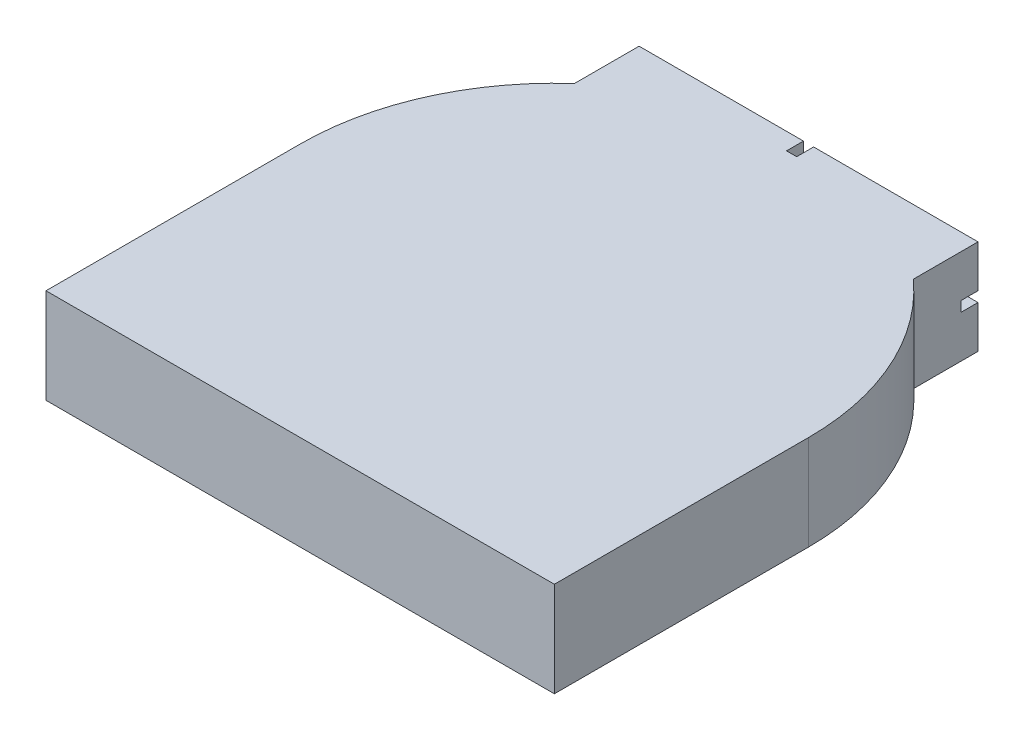
ISO-10303-21;
HEADER;
FILE_DESCRIPTION(('STEP AP214'),'2;1');
FILE_NAME('part.step','',(''),(''),'','','');
FILE_SCHEMA(('AUTOMOTIVE_DESIGN { 1 0 10303 214 1 1 1 1 }'));
ENDSEC;
DATA;
#1=APPLICATION_CONTEXT('core data for automotive mechanical design processes');
#2=APPLICATION_PROTOCOL_DEFINITION('international standard','automotive_design',2000,#1);
#3=PRODUCT_CONTEXT('',#1,'mechanical');
#4=PRODUCT('Part','Part','',(#3));
#5=PRODUCT_RELATED_PRODUCT_CATEGORY('part','',(#4));
#6=PRODUCT_DEFINITION_FORMATION('','',#4);
#7=PRODUCT_DEFINITION_CONTEXT('part definition',#1,'design');
#8=PRODUCT_DEFINITION('design','',#6,#7);
#9=PRODUCT_DEFINITION_SHAPE('','',#8);
#10=(LENGTH_UNIT() NAMED_UNIT(*) SI_UNIT(.MILLI.,.METRE.));
#11=(NAMED_UNIT(*) PLANE_ANGLE_UNIT() SI_UNIT($,.RADIAN.));
#12=(NAMED_UNIT(*) SI_UNIT($,.STERADIAN.) SOLID_ANGLE_UNIT());
#13=UNCERTAINTY_MEASURE_WITH_UNIT(LENGTH_MEASURE(1.E-05),#10,'distance_accuracy_value','');
#14=(GEOMETRIC_REPRESENTATION_CONTEXT(3) GLOBAL_UNCERTAINTY_ASSIGNED_CONTEXT((#13)) GLOBAL_UNIT_ASSIGNED_CONTEXT((#10,
#11,#12)) REPRESENTATION_CONTEXT('',''));
#15=CARTESIAN_POINT('',(0.,0.,0.));
#16=DIRECTION('',(0.,0.,1.));
#17=DIRECTION('',(1.,0.,0.));
#18=AXIS2_PLACEMENT_3D('',#15,#16,#17);
#19=CARTESIAN_POINT('',(3.,0.8,-7.5));
#20=DIRECTION('',(0.,0.,1.));
#21=DIRECTION('',(1.,0.,0.));
#22=AXIS2_PLACEMENT_3D('',#19,#20,#21);
#23=PLANE('',#22);
#24=DIRECTION('',(-1.,0.,0.));
#25=VECTOR('',#24,1.);
#26=CARTESIAN_POINT('',(-3.,0.8,-7.5));
#27=LINE('',#26,#25);
#28=CARTESIAN_POINT('',(3.,0.8,-7.5));
#29=VERTEX_POINT('',#28);
#30=CARTESIAN_POINT('',(0.15,0.8,-7.5));
#31=VERTEX_POINT('',#30);
#32=EDGE_CURVE('E360',#29,#31,#27,.T.);
#33=ORIENTED_EDGE('',*,*,#32,.T.);
#34=DIRECTION('',(0.,-1.,0.));
#35=VECTOR('',#34,1.);
#36=CARTESIAN_POINT('',(0.15,1.8,-7.5));
#37=LINE('',#36,#35);
#38=CARTESIAN_POINT('',(0.15,1.8,-7.5));
#39=VERTEX_POINT('',#38);
#40=EDGE_CURVE('E280',#39,#31,#37,.T.);
#41=ORIENTED_EDGE('',*,*,#40,.F.);
#42=DIRECTION('',(-1.,0.,0.));
#43=VECTOR('',#42,1.);
#44=CARTESIAN_POINT('',(5.,1.8,-7.5));
#45=LINE('',#44,#43);
#46=CARTESIAN_POINT('',(5.,1.8,-7.5));
#47=VERTEX_POINT('',#46);
#48=EDGE_CURVE('E364',#47,#39,#45,.T.);
#49=ORIENTED_EDGE('',*,*,#48,.F.);
#50=DIRECTION('',(0.,-1.,0.));
#51=VECTOR('',#50,1.);
#52=CARTESIAN_POINT('',(5.,0.8,-7.5));
#53=LINE('',#52,#51);
#54=CARTESIAN_POINT('',(5.,0.55,-7.5));
#55=VERTEX_POINT('',#54);
#56=EDGE_CURVE('E428',#47,#55,#53,.T.);
#57=ORIENTED_EDGE('',*,*,#56,.T.);
#58=DIRECTION('',(1.,0.,0.));
#59=VECTOR('',#58,1.);
#60=CARTESIAN_POINT('',(5.,0.55,-7.5));
#61=LINE('',#60,#59);
#62=CARTESIAN_POINT('',(3.,0.55,-7.5));
#63=VERTEX_POINT('',#62);
#64=EDGE_CURVE('E248',#63,#55,#61,.T.);
#65=ORIENTED_EDGE('',*,*,#64,.F.);
#66=DIRECTION('',(0.,-1.,0.));
#67=VECTOR('',#66,1.);
#68=CARTESIAN_POINT('',(3.,0.8,-7.5));
#69=LINE('',#68,#67);
#70=EDGE_CURVE('E424',#29,#63,#69,.T.);
#71=ORIENTED_EDGE('',*,*,#70,.F.);
#72=EDGE_LOOP('',(#33,#41,#49,#57,#65,#71));
#73=FACE_BOUND('',#72,.T.);
#74=ADVANCED_FACE('F36',(#73),#23,.F.);
#75=CARTESIAN_POINT('',(-0.15,1.8,-7.5));
#76=VERTEX_POINT('',#75);
#77=CARTESIAN_POINT('',(-5.,1.8,-7.5));
#78=VERTEX_POINT('',#77);
#79=EDGE_CURVE('E363',#76,#78,#45,.T.);
#80=ORIENTED_EDGE('',*,*,#79,.F.);
#81=DIRECTION('',(0.,1.,0.));
#82=VECTOR('',#81,1.);
#83=CARTESIAN_POINT('',(-0.15,1.8,-7.5));
#84=LINE('',#83,#82);
#85=CARTESIAN_POINT('',(-0.15,0.8,-7.5));
#86=VERTEX_POINT('',#85);
#87=EDGE_CURVE('E293',#86,#76,#84,.T.);
#88=ORIENTED_EDGE('',*,*,#87,.F.);
#89=CARTESIAN_POINT('',(-3.,0.8,-7.5));
#90=VERTEX_POINT('',#89);
#91=EDGE_CURVE('E352',#86,#90,#27,.T.);
#92=ORIENTED_EDGE('',*,*,#91,.T.);
#93=DIRECTION('',(0.,-1.,0.));
#94=VECTOR('',#93,1.);
#95=CARTESIAN_POINT('',(-3.,0.8,-7.5));
#96=LINE('',#95,#94);
#97=CARTESIAN_POINT('',(-3.,0.55,-7.5));
#98=VERTEX_POINT('',#97);
#99=EDGE_CURVE('E447',#90,#98,#96,.T.);
#100=ORIENTED_EDGE('',*,*,#99,.T.);
#101=DIRECTION('',(1.,0.,0.));
#102=VECTOR('',#101,1.);
#103=CARTESIAN_POINT('',(-0.15,0.55,-7.5));
#104=LINE('',#103,#102);
#105=CARTESIAN_POINT('',(-5.,0.55,-7.5));
#106=VERTEX_POINT('',#105);
#107=EDGE_CURVE('E291',#106,#98,#104,.T.);
#108=ORIENTED_EDGE('',*,*,#107,.F.);
#109=DIRECTION('',(0.,-1.,0.));
#110=VECTOR('',#109,1.);
#111=CARTESIAN_POINT('',(-5.,0.8,-7.5));
#112=LINE('',#111,#110);
#113=EDGE_CURVE('E443',#78,#106,#112,.T.);
#114=ORIENTED_EDGE('',*,*,#113,.F.);
#115=EDGE_LOOP('',(#80,#88,#92,#100,#108,#114));
#116=FACE_BOUND('',#115,.T.);
#117=ADVANCED_FACE('F522',(#116),#23,.F.);
#118=CARTESIAN_POINT('',(-5.,0.25,-7.5));
#119=VERTEX_POINT('',#118);
#120=CARTESIAN_POINT('',(-5.,-1.,-7.5));
#121=VERTEX_POINT('',#120);
#122=EDGE_CURVE('E442',#119,#121,#112,.T.);
#123=ORIENTED_EDGE('',*,*,#122,.F.);
#124=DIRECTION('',(-1.,0.,0.));
#125=VECTOR('',#124,1.);
#126=CARTESIAN_POINT('',(-0.15,0.25,-7.5));
#127=LINE('',#126,#125);
#128=CARTESIAN_POINT('',(-3.,0.25,-7.5));
#129=VERTEX_POINT('',#128);
#130=EDGE_CURVE('E289',#129,#119,#127,.T.);
#131=ORIENTED_EDGE('',*,*,#130,.F.);
#132=CARTESIAN_POINT('',(-3.,0.,-7.5));
#133=VERTEX_POINT('',#132);
#134=EDGE_CURVE('E446',#129,#133,#96,.T.);
#135=ORIENTED_EDGE('',*,*,#134,.T.);
#136=DIRECTION('',(1.,0.,0.));
#137=VECTOR('',#136,1.);
#138=CARTESIAN_POINT('',(-3.,0.,-7.5));
#139=LINE('',#138,#137);
#140=CARTESIAN_POINT('',(-0.15,0.,-7.5));
#141=VERTEX_POINT('',#140);
#142=EDGE_CURVE('E353',#133,#141,#139,.T.);
#143=ORIENTED_EDGE('',*,*,#142,.T.);
#144=DIRECTION('',(0.,1.,0.));
#145=VECTOR('',#144,1.);
#146=CARTESIAN_POINT('',(-0.15,0.25,-7.5));
#147=LINE('',#146,#145);
#148=CARTESIAN_POINT('',(-0.15,-1.,-7.5));
#149=VERTEX_POINT('',#148);
#150=EDGE_CURVE('E287',#149,#141,#147,.T.);
#151=ORIENTED_EDGE('',*,*,#150,.F.);
#152=DIRECTION('',(1.,0.,0.));
#153=VECTOR('',#152,1.);
#154=CARTESIAN_POINT('',(-3.,-1.,-7.5));
#155=LINE('',#154,#153);
#156=EDGE_CURVE('E327',#121,#149,#155,.T.);
#157=ORIENTED_EDGE('',*,*,#156,.F.);
#158=EDGE_LOOP('',(#123,#131,#135,#143,#151,#157));
#159=FACE_BOUND('',#158,.T.);
#160=ADVANCED_FACE('F567',(#159),#23,.F.);
#161=CARTESIAN_POINT('',(-4.,0.8,-5.1234753829798));
#162=DIRECTION('',(0.,-1.,0.));
#163=DIRECTION('',(0.,0.,-1.));
#164=AXIS2_PLACEMENT_3D('',#161,#162,#163);
#165=CYLINDRICAL_SURFACE('',#164,1.);
#166=CARTESIAN_POINT('',(-4.,0.,-5.1234753829798));
#167=DIRECTION('',(0.,1.,0.));
#168=DIRECTION('',(0.,0.,1.));
#169=AXIS2_PLACEMENT_3D('',#166,#167,#168);
#170=CIRCLE('',#169,1.);
#171=CARTESIAN_POINT('',(-3.38461538461538,0.,-4.33524840098291));
#172=VERTEX_POINT('',#171);
#173=CARTESIAN_POINT('',(-3.,0.,-5.1234753829798));
#174=VERTEX_POINT('',#173);
#175=EDGE_CURVE('E382',#172,#174,#170,.T.);
#176=ORIENTED_EDGE('',*,*,#175,.T.);
#177=DIRECTION('',(0.,-1.,0.));
#178=VECTOR('',#177,1.);
#179=CARTESIAN_POINT('',(-3.,0.8,-5.1234753829798));
#180=LINE('',#179,#178);
#181=CARTESIAN_POINT('',(-3.,0.8,-5.1234753829798));
#182=VERTEX_POINT('',#181);
#183=EDGE_CURVE('E450',#182,#174,#180,.T.);
#184=ORIENTED_EDGE('',*,*,#183,.F.);
#185=CARTESIAN_POINT('',(-4.,0.8,-5.1234753829798));
#186=DIRECTION('',(0.,1.,0.));
#187=DIRECTION('',(0.,0.,1.));
#188=AXIS2_PLACEMENT_3D('',#185,#186,#187);
#189=CIRCLE('',#188,1.);
#190=CARTESIAN_POINT('',(-3.38461538461538,0.8,-4.33524840098291));
#191=VERTEX_POINT('',#190);
#192=EDGE_CURVE('E385',#191,#182,#189,.T.);
#193=ORIENTED_EDGE('',*,*,#192,.F.);
#194=DIRECTION('',(0.,-1.,0.));
#195=VECTOR('',#194,1.);
#196=CARTESIAN_POINT('',(-3.38461538461538,0.8,-4.33524840098291));
#197=LINE('',#196,#195);
#198=EDGE_CURVE('E401',#191,#172,#197,.T.);
#199=ORIENTED_EDGE('',*,*,#198,.T.);
#200=EDGE_LOOP('',(#176,#184,#193,#199));
#201=FACE_BOUND('',#200,.T.);
#202=ADVANCED_FACE('F38',(#201),#165,.T.);
#203=CARTESIAN_POINT('',(-3.,0.8,-5.5));
#204=DIRECTION('',(-1.,0.,0.));
#205=DIRECTION('',(0.,0.,1.));
#206=AXIS2_PLACEMENT_3D('',#203,#204,#205);
#207=PLANE('',#206);
#208=DIRECTION('',(0.,-1.,0.));
#209=VECTOR('',#208,1.);
#210=CARTESIAN_POINT('',(-3.,0.8,-7.));
#211=LINE('',#210,#209);
#212=CARTESIAN_POINT('',(-3.,0.55,-7.));
#213=VERTEX_POINT('',#212);
#214=CARTESIAN_POINT('',(-3.,0.25,-7.));
#215=VERTEX_POINT('',#214);
#216=EDGE_CURVE('E314',#213,#215,#211,.T.);
#217=ORIENTED_EDGE('',*,*,#216,.F.);
#218=DIRECTION('',(0.,0.,-1.));
#219=VECTOR('',#218,1.);
#220=CARTESIAN_POINT('',(-3.,0.55,-5.5));
#221=LINE('',#220,#219);
#222=EDGE_CURVE('E323',#213,#98,#221,.T.);
#223=ORIENTED_EDGE('',*,*,#222,.T.);
#224=ORIENTED_EDGE('',*,*,#99,.F.);
#225=DIRECTION('',(0.,0.,-1.));
#226=VECTOR('',#225,1.);
#227=CARTESIAN_POINT('',(-3.,0.8,-5.5));
#228=LINE('',#227,#226);
#229=EDGE_CURVE('E388',#182,#90,#228,.T.);
#230=ORIENTED_EDGE('',*,*,#229,.F.);
#231=ORIENTED_EDGE('',*,*,#183,.T.);
#232=DIRECTION('',(0.,0.,-1.));
#233=VECTOR('',#232,1.);
#234=CARTESIAN_POINT('',(-3.,0.,-5.5));
#235=LINE('',#234,#233);
#236=EDGE_CURVE('E404',#174,#133,#235,.T.);
#237=ORIENTED_EDGE('',*,*,#236,.T.);
#238=ORIENTED_EDGE('',*,*,#134,.F.);
#239=DIRECTION('',(0.,0.,1.));
#240=VECTOR('',#239,1.);
#241=CARTESIAN_POINT('',(-3.,0.25,-5.5));
#242=LINE('',#241,#240);
#243=EDGE_CURVE('E51',#129,#215,#242,.T.);
#244=ORIENTED_EDGE('',*,*,#243,.T.);
#245=EDGE_LOOP('',(#217,#223,#224,#230,#231,#237,#238,#244));
#246=FACE_BOUND('',#245,.T.);
#247=ADVANCED_FACE('F526',(#246),#207,.F.);
#248=CARTESIAN_POINT('',(-5.,0.8,-7.5));
#249=DIRECTION('',(1.,0.,0.));
#250=DIRECTION('',(0.,0.,-1.));
#251=AXIS2_PLACEMENT_3D('',#248,#249,#250);
#252=PLANE('',#251);
#253=ORIENTED_EDGE('',*,*,#113,.T.);
#254=DIRECTION('',(0.,0.,-1.));
#255=VECTOR('',#254,1.);
#256=CARTESIAN_POINT('',(-5.,0.55,-7.));
#257=LINE('',#256,#255);
#258=CARTESIAN_POINT('',(-5.,0.55,-7.));
#259=VERTEX_POINT('',#258);
#260=EDGE_CURVE('E301',#259,#106,#257,.T.);
#261=ORIENTED_EDGE('',*,*,#260,.F.);
#262=DIRECTION('',(0.,1.,0.));
#263=VECTOR('',#262,1.);
#264=CARTESIAN_POINT('',(-5.,0.55,-7.));
#265=LINE('',#264,#263);
#266=CARTESIAN_POINT('',(-5.,0.25,-7.));
#267=VERTEX_POINT('',#266);
#268=EDGE_CURVE('E269',#267,#259,#265,.T.);
#269=ORIENTED_EDGE('',*,*,#268,.F.);
#270=DIRECTION('',(0.,0.,-1.));
#271=VECTOR('',#270,1.);
#272=CARTESIAN_POINT('',(-5.,0.25,-7.));
#273=LINE('',#272,#271);
#274=EDGE_CURVE('E303',#267,#119,#273,.T.);
#275=ORIENTED_EDGE('',*,*,#274,.T.);
#276=ORIENTED_EDGE('',*,*,#122,.T.);
#277=DIRECTION('',(0.,0.,-1.));
#278=VECTOR('',#277,1.);
#279=CARTESIAN_POINT('',(-5.,-1.,-7.5));
#280=LINE('',#279,#278);
#281=CARTESIAN_POINT('',(-5.,-1.,-5.59016994374947));
#282=VERTEX_POINT('',#281);
#283=EDGE_CURVE('E349',#282,#121,#280,.T.);
#284=ORIENTED_EDGE('',*,*,#283,.F.);
#285=DIRECTION('',(0.,-1.,0.));
#286=VECTOR('',#285,1.);
#287=CARTESIAN_POINT('',(-5.,0.8,-5.59016994374947));
#288=LINE('',#287,#286);
#289=CARTESIAN_POINT('',(-5.,1.8,-5.59016994374947));
#290=VERTEX_POINT('',#289);
#291=EDGE_CURVE('E440',#290,#282,#288,.T.);
#292=ORIENTED_EDGE('',*,*,#291,.F.);
#293=DIRECTION('',(0.,0.,1.));
#294=VECTOR('',#293,1.);
#295=CARTESIAN_POINT('',(-5.,1.8,-7.5));
#296=LINE('',#295,#294);
#297=EDGE_CURVE('E367',#78,#290,#296,.T.);
#298=ORIENTED_EDGE('',*,*,#297,.F.);
#299=EDGE_LOOP('',(#253,#261,#269,#275,#276,#284,#292,#298));
#300=FACE_BOUND('',#299,.T.);
#301=ADVANCED_FACE('F536',(#300),#252,.F.);
#302=CARTESIAN_POINT('',(0.,0.8,0.));
#303=DIRECTION('',(0.,-1.,0.));
#304=DIRECTION('',(0.,0.,-1.));
#305=AXIS2_PLACEMENT_3D('',#302,#303,#304);
#306=CYLINDRICAL_SURFACE('',#305,7.5);
#307=ORIENTED_EDGE('',*,*,#291,.T.);
#308=CARTESIAN_POINT('',(0.,-1.,0.));
#309=DIRECTION('',(0.,-1.,0.));
#310=DIRECTION('',(0.,0.,-1.));
#311=AXIS2_PLACEMENT_3D('',#308,#309,#310);
#312=CIRCLE('',#311,7.5);
#313=CARTESIAN_POINT('',(-7.5,-1.,0.));
#314=VERTEX_POINT('',#313);
#315=EDGE_CURVE('E346',#314,#282,#312,.T.);
#316=ORIENTED_EDGE('',*,*,#315,.F.);
#317=DIRECTION('',(0.,-1.,0.));
#318=VECTOR('',#317,1.);
#319=CARTESIAN_POINT('',(-7.5,0.8,0.));
#320=LINE('',#319,#318);
#321=CARTESIAN_POINT('',(-7.5,1.8,0.));
#322=VERTEX_POINT('',#321);
#323=EDGE_CURVE('E438',#322,#314,#320,.T.);
#324=ORIENTED_EDGE('',*,*,#323,.F.);
#325=CARTESIAN_POINT('',(0.,1.8,0.));
#326=DIRECTION('',(0.,1.,0.));
#327=DIRECTION('',(0.,0.,1.));
#328=AXIS2_PLACEMENT_3D('',#325,#326,#327);
#329=CIRCLE('',#328,7.5);
#330=EDGE_CURVE('E370',#290,#322,#329,.T.);
#331=ORIENTED_EDGE('',*,*,#330,.F.);
#332=EDGE_LOOP('',(#307,#316,#324,#331));
#333=FACE_BOUND('',#332,.T.);
#334=ADVANCED_FACE('F543',(#333),#306,.T.);
#335=CARTESIAN_POINT('',(-7.5,0.8,0.));
#336=DIRECTION('',(1.,0.,0.));
#337=DIRECTION('',(0.,0.,-1.));
#338=AXIS2_PLACEMENT_3D('',#335,#336,#337);
#339=PLANE('',#338);
#340=ORIENTED_EDGE('',*,*,#323,.T.);
#341=DIRECTION('',(0.,0.,-1.));
#342=VECTOR('',#341,1.);
#343=CARTESIAN_POINT('',(-7.5,-1.,0.));
#344=LINE('',#343,#342);
#345=CARTESIAN_POINT('',(-7.5,-1.,7.5));
#346=VERTEX_POINT('',#345);
#347=EDGE_CURVE('E343',#346,#314,#344,.T.);
#348=ORIENTED_EDGE('',*,*,#347,.F.);
#349=DIRECTION('',(0.,-1.,0.));
#350=VECTOR('',#349,1.);
#351=CARTESIAN_POINT('',(-7.5,0.8,7.5));
#352=LINE('',#351,#350);
#353=CARTESIAN_POINT('',(-7.5,1.8,7.5));
#354=VERTEX_POINT('',#353);
#355=EDGE_CURVE('E436',#354,#346,#352,.T.);
#356=ORIENTED_EDGE('',*,*,#355,.F.);
#357=DIRECTION('',(0.,0.,1.));
#358=VECTOR('',#357,1.);
#359=CARTESIAN_POINT('',(-7.5,1.8,0.));
#360=LINE('',#359,#358);
#361=EDGE_CURVE('E373',#322,#354,#360,.T.);
#362=ORIENTED_EDGE('',*,*,#361,.F.);
#363=EDGE_LOOP('',(#340,#348,#356,#362));
#364=FACE_BOUND('',#363,.T.);
#365=ADVANCED_FACE('F547',(#364),#339,.F.);
#366=CARTESIAN_POINT('',(-7.5,0.8,7.5));
#367=DIRECTION('',(0.,0.,-1.));
#368=DIRECTION('',(-1.,0.,0.));
#369=AXIS2_PLACEMENT_3D('',#366,#367,#368);
#370=PLANE('',#369);
#371=ORIENTED_EDGE('',*,*,#355,.T.);
#372=DIRECTION('',(-1.,0.,0.));
#373=VECTOR('',#372,1.);
#374=CARTESIAN_POINT('',(-7.5,-1.,7.5));
#375=LINE('',#374,#373);
#376=CARTESIAN_POINT('',(7.5,-1.,7.5));
#377=VERTEX_POINT('',#376);
#378=EDGE_CURVE('E340',#377,#346,#375,.T.);
#379=ORIENTED_EDGE('',*,*,#378,.F.);
#380=DIRECTION('',(0.,-1.,0.));
#381=VECTOR('',#380,1.);
#382=CARTESIAN_POINT('',(7.5,0.8,7.5));
#383=LINE('',#382,#381);
#384=CARTESIAN_POINT('',(7.5,1.8,7.5));
#385=VERTEX_POINT('',#384);
#386=EDGE_CURVE('E434',#385,#377,#383,.T.);
#387=ORIENTED_EDGE('',*,*,#386,.F.);
#388=DIRECTION('',(1.,0.,0.));
#389=VECTOR('',#388,1.);
#390=CARTESIAN_POINT('',(-7.5,1.8,7.5));
#391=LINE('',#390,#389);
#392=EDGE_CURVE('E376',#354,#385,#391,.T.);
#393=ORIENTED_EDGE('',*,*,#392,.F.);
#394=EDGE_LOOP('',(#371,#379,#387,#393));
#395=FACE_BOUND('',#394,.T.);
#396=ADVANCED_FACE('F550',(#395),#370,.F.);
#397=CARTESIAN_POINT('',(7.5,0.8,7.5));
#398=DIRECTION('',(-1.,0.,0.));
#399=DIRECTION('',(0.,0.,1.));
#400=AXIS2_PLACEMENT_3D('',#397,#398,#399);
#401=PLANE('',#400);
#402=ORIENTED_EDGE('',*,*,#386,.T.);
#403=DIRECTION('',(0.,0.,1.));
#404=VECTOR('',#403,1.);
#405=CARTESIAN_POINT('',(7.5,-1.,7.5));
#406=LINE('',#405,#404);
#407=CARTESIAN_POINT('',(7.5,-1.,0.));
#408=VERTEX_POINT('',#407);
#409=EDGE_CURVE('E337',#408,#377,#406,.T.);
#410=ORIENTED_EDGE('',*,*,#409,.F.);
#411=DIRECTION('',(0.,-1.,0.));
#412=VECTOR('',#411,1.);
#413=CARTESIAN_POINT('',(7.5,0.8,0.));
#414=LINE('',#413,#412);
#415=CARTESIAN_POINT('',(7.5,1.8,0.));
#416=VERTEX_POINT('',#415);
#417=EDGE_CURVE('E432',#416,#408,#414,.T.);
#418=ORIENTED_EDGE('',*,*,#417,.F.);
#419=DIRECTION('',(0.,0.,-1.));
#420=VECTOR('',#419,1.);
#421=CARTESIAN_POINT('',(7.5,1.8,7.5));
#422=LINE('',#421,#420);
#423=EDGE_CURVE('E379',#385,#416,#422,.T.);
#424=ORIENTED_EDGE('',*,*,#423,.F.);
#425=EDGE_LOOP('',(#402,#410,#418,#424));
#426=FACE_BOUND('',#425,.T.);
#427=ADVANCED_FACE('F553',(#426),#401,.F.);
#428=CARTESIAN_POINT('',(0.,0.8,0.));
#429=DIRECTION('',(0.,-1.,0.));
#430=DIRECTION('',(0.,0.,-1.));
#431=AXIS2_PLACEMENT_3D('',#428,#429,#430);
#432=CYLINDRICAL_SURFACE('',#431,7.5);
#433=ORIENTED_EDGE('',*,*,#417,.T.);
#434=CARTESIAN_POINT('',(0.,-1.,0.));
#435=DIRECTION('',(0.,-1.,0.));
#436=DIRECTION('',(0.,0.,-1.));
#437=AXIS2_PLACEMENT_3D('',#434,#435,#436);
#438=CIRCLE('',#437,7.5);
#439=CARTESIAN_POINT('',(5.,-1.,-5.59016994374947));
#440=VERTEX_POINT('',#439);
#441=EDGE_CURVE('E334',#440,#408,#438,.T.);
#442=ORIENTED_EDGE('',*,*,#441,.F.);
#443=DIRECTION('',(0.,-1.,0.));
#444=VECTOR('',#443,1.);
#445=CARTESIAN_POINT('',(5.,0.8,-5.59016994374947));
#446=LINE('',#445,#444);
#447=CARTESIAN_POINT('',(5.,1.8,-5.59016994374947));
#448=VERTEX_POINT('',#447);
#449=EDGE_CURVE('E430',#448,#440,#446,.T.);
#450=ORIENTED_EDGE('',*,*,#449,.F.);
#451=CARTESIAN_POINT('',(0.,1.8,0.));
#452=DIRECTION('',(0.,1.,0.));
#453=DIRECTION('',(0.,0.,1.));
#454=AXIS2_PLACEMENT_3D('',#451,#452,#453);
#455=CIRCLE('',#454,7.5);
#456=EDGE_CURVE('E356',#416,#448,#455,.T.);
#457=ORIENTED_EDGE('',*,*,#456,.F.);
#458=EDGE_LOOP('',(#433,#442,#450,#457));
#459=FACE_BOUND('',#458,.T.);
#460=ADVANCED_FACE('F473',(#459),#432,.T.);
#461=CARTESIAN_POINT('',(5.,0.8,-7.5));
#462=DIRECTION('',(-1.,0.,0.));
#463=DIRECTION('',(0.,0.,1.));
#464=AXIS2_PLACEMENT_3D('',#461,#462,#463);
#465=PLANE('',#464);
#466=CARTESIAN_POINT('',(5.,0.25,-7.5));
#467=VERTEX_POINT('',#466);
#468=CARTESIAN_POINT('',(5.,-1.,-7.5));
#469=VERTEX_POINT('',#468);
#470=EDGE_CURVE('E427',#467,#469,#53,.T.);
#471=ORIENTED_EDGE('',*,*,#470,.F.);
#472=DIRECTION('',(0.,0.,-1.));
#473=VECTOR('',#472,1.);
#474=CARTESIAN_POINT('',(5.,0.25,-7.));
#475=LINE('',#474,#473);
#476=CARTESIAN_POINT('',(5.,0.25,-7.));
#477=VERTEX_POINT('',#476);
#478=EDGE_CURVE('E251',#477,#467,#475,.T.);
#479=ORIENTED_EDGE('',*,*,#478,.F.);
#480=DIRECTION('',(0.,-1.,0.));
#481=VECTOR('',#480,1.);
#482=CARTESIAN_POINT('',(5.,0.55,-7.));
#483=LINE('',#482,#481);
#484=CARTESIAN_POINT('',(5.,0.55,-7.));
#485=VERTEX_POINT('',#484);
#486=EDGE_CURVE('E236',#485,#477,#483,.T.);
#487=ORIENTED_EDGE('',*,*,#486,.F.);
#488=DIRECTION('',(0.,0.,-1.));
#489=VECTOR('',#488,1.);
#490=CARTESIAN_POINT('',(5.,0.55,-7.));
#491=LINE('',#490,#489);
#492=EDGE_CURVE('E245',#485,#55,#491,.T.);
#493=ORIENTED_EDGE('',*,*,#492,.T.);
#494=ORIENTED_EDGE('',*,*,#56,.F.);
#495=DIRECTION('',(0.,0.,-1.));
#496=VECTOR('',#495,1.);
#497=CARTESIAN_POINT('',(5.,1.8,-5.59016994374947));
#498=LINE('',#497,#496);
#499=EDGE_CURVE('E359',#448,#47,#498,.T.);
#500=ORIENTED_EDGE('',*,*,#499,.F.);
#501=ORIENTED_EDGE('',*,*,#449,.T.);
#502=DIRECTION('',(0.,0.,1.));
#503=VECTOR('',#502,1.);
#504=CARTESIAN_POINT('',(5.,-1.,-5.59016994374947));
#505=LINE('',#504,#503);
#506=EDGE_CURVE('E330',#469,#440,#505,.T.);
#507=ORIENTED_EDGE('',*,*,#506,.F.);
#508=EDGE_LOOP('',(#471,#479,#487,#493,#494,#500,#501,#507));
#509=FACE_BOUND('',#508,.T.);
#510=ADVANCED_FACE('F255',(#509),#465,.F.);
#511=CARTESIAN_POINT('',(0.15,-1.,-7.5));
#512=VERTEX_POINT('',#511);
#513=EDGE_CURVE('E331',#512,#469,#155,.T.);
#514=ORIENTED_EDGE('',*,*,#513,.F.);
#515=DIRECTION('',(0.,-1.,0.));
#516=VECTOR('',#515,1.);
#517=CARTESIAN_POINT('',(0.15,0.25,-7.5));
#518=LINE('',#517,#516);
#519=CARTESIAN_POINT('',(0.15,0.,-7.5));
#520=VERTEX_POINT('',#519);
#521=EDGE_CURVE('E285',#520,#512,#518,.T.);
#522=ORIENTED_EDGE('',*,*,#521,.F.);
#523=CARTESIAN_POINT('',(3.,0.,-7.5));
#524=VERTEX_POINT('',#523);
#525=EDGE_CURVE('E326',#520,#524,#139,.T.);
#526=ORIENTED_EDGE('',*,*,#525,.T.);
#527=CARTESIAN_POINT('',(3.,0.25,-7.5));
#528=VERTEX_POINT('',#527);
#529=EDGE_CURVE('E423',#528,#524,#69,.T.);
#530=ORIENTED_EDGE('',*,*,#529,.F.);
#531=DIRECTION('',(-1.,0.,0.));
#532=VECTOR('',#531,1.);
#533=CARTESIAN_POINT('',(5.,0.25,-7.5));
#534=LINE('',#533,#532);
#535=EDGE_CURVE('E283',#467,#528,#534,.T.);
#536=ORIENTED_EDGE('',*,*,#535,.F.);
#537=ORIENTED_EDGE('',*,*,#470,.T.);
#538=EDGE_LOOP('',(#514,#522,#526,#530,#536,#537));
#539=FACE_BOUND('',#538,.T.);
#540=ADVANCED_FACE('F486',(#539),#23,.F.);
#541=CARTESIAN_POINT('',(3.,0.8,-5.5));
#542=DIRECTION('',(1.,0.,0.));
#543=DIRECTION('',(0.,0.,-1.));
#544=AXIS2_PLACEMENT_3D('',#541,#542,#543);
#545=PLANE('',#544);
#546=DIRECTION('',(0.,1.,0.));
#547=VECTOR('',#546,1.);
#548=CARTESIAN_POINT('',(3.,0.8,-7.));
#549=LINE('',#548,#547);
#550=CARTESIAN_POINT('',(3.,0.25,-7.));
#551=VERTEX_POINT('',#550);
#552=CARTESIAN_POINT('',(3.,0.55,-7.));
#553=VERTEX_POINT('',#552);
#554=EDGE_CURVE('E239',#551,#553,#549,.T.);
#555=ORIENTED_EDGE('',*,*,#554,.F.);
#556=DIRECTION('',(0.,0.,-1.));
#557=VECTOR('',#556,1.);
#558=CARTESIAN_POINT('',(3.,0.25,-5.5));
#559=LINE('',#558,#557);
#560=EDGE_CURVE('E11',#551,#528,#559,.T.);
#561=ORIENTED_EDGE('',*,*,#560,.T.);
#562=ORIENTED_EDGE('',*,*,#529,.T.);
#563=DIRECTION('',(0.,0.,1.));
#564=VECTOR('',#563,1.);
#565=CARTESIAN_POINT('',(3.,0.,-5.5));
#566=LINE('',#565,#564);
#567=CARTESIAN_POINT('',(3.,0.,-5.1234753829798));
#568=VERTEX_POINT('',#567);
#569=EDGE_CURVE('E407',#524,#568,#566,.T.);
#570=ORIENTED_EDGE('',*,*,#569,.T.);
#571=DIRECTION('',(0.,-1.,0.));
#572=VECTOR('',#571,1.);
#573=CARTESIAN_POINT('',(3.,0.8,-5.1234753829798));
#574=LINE('',#573,#572);
#575=CARTESIAN_POINT('',(3.,0.8,-5.1234753829798));
#576=VERTEX_POINT('',#575);
#577=EDGE_CURVE('E420',#576,#568,#574,.T.);
#578=ORIENTED_EDGE('',*,*,#577,.F.);
#579=DIRECTION('',(0.,0.,1.));
#580=VECTOR('',#579,1.);
#581=CARTESIAN_POINT('',(3.,0.8,-5.5));
#582=LINE('',#581,#580);
#583=EDGE_CURVE('E392',#29,#576,#582,.T.);
#584=ORIENTED_EDGE('',*,*,#583,.F.);
#585=ORIENTED_EDGE('',*,*,#70,.T.);
#586=DIRECTION('',(0.,0.,1.));
#587=VECTOR('',#586,1.);
#588=CARTESIAN_POINT('',(3.,0.55,-5.5));
#589=LINE('',#588,#587);
#590=EDGE_CURVE('E44',#63,#553,#589,.T.);
#591=ORIENTED_EDGE('',*,*,#590,.T.);
#592=EDGE_LOOP('',(#555,#561,#562,#570,#578,#584,#585,#591));
#593=FACE_BOUND('',#592,.T.);
#594=ADVANCED_FACE('F461',(#593),#545,.F.);
#595=CARTESIAN_POINT('',(4.,0.8,-5.1234753829798));
#596=DIRECTION('',(0.,-1.,0.));
#597=DIRECTION('',(0.,0.,-1.));
#598=AXIS2_PLACEMENT_3D('',#595,#596,#597);
#599=CYLINDRICAL_SURFACE('',#598,1.);
#600=CARTESIAN_POINT('',(4.,0.,-5.1234753829798));
#601=DIRECTION('',(0.,1.,0.));
#602=DIRECTION('',(0.,0.,-1.));
#603=AXIS2_PLACEMENT_3D('',#600,#601,#602);
#604=CIRCLE('',#603,1.);
#605=CARTESIAN_POINT('',(3.38461538461539,0.,-4.33524840098291));
#606=VERTEX_POINT('',#605);
#607=EDGE_CURVE('E410',#568,#606,#604,.T.);
#608=ORIENTED_EDGE('',*,*,#607,.T.);
#609=DIRECTION('',(0.,-1.,0.));
#610=VECTOR('',#609,1.);
#611=CARTESIAN_POINT('',(3.38461538461539,0.8,-4.33524840098291));
#612=LINE('',#611,#610);
#613=CARTESIAN_POINT('',(3.38461538461539,0.8,-4.33524840098291));
#614=VERTEX_POINT('',#613);
#615=EDGE_CURVE('E417',#614,#606,#612,.T.);
#616=ORIENTED_EDGE('',*,*,#615,.F.);
#617=CARTESIAN_POINT('',(4.,0.8,-5.1234753829798));
#618=DIRECTION('',(0.,1.,0.));
#619=DIRECTION('',(0.,0.,-1.));
#620=AXIS2_PLACEMENT_3D('',#617,#618,#619);
#621=CIRCLE('',#620,1.);
#622=EDGE_CURVE('E395',#576,#614,#621,.T.);
#623=ORIENTED_EDGE('',*,*,#622,.F.);
#624=ORIENTED_EDGE('',*,*,#577,.T.);
#625=EDGE_LOOP('',(#608,#616,#623,#624));
#626=FACE_BOUND('',#625,.T.);
#627=ADVANCED_FACE('F498',(#626),#599,.T.);
#628=CARTESIAN_POINT('',(0.,0.8,0.));
#629=DIRECTION('',(0.,-1.,0.));
#630=DIRECTION('',(0.,0.,-1.));
#631=AXIS2_PLACEMENT_3D('',#628,#629,#630);
#632=CYLINDRICAL_SURFACE('',#631,5.5);
#633=CARTESIAN_POINT('',(0.,0.,0.));
#634=DIRECTION('',(0.,-1.,0.));
#635=DIRECTION('',(0.,0.,1.));
#636=AXIS2_PLACEMENT_3D('',#633,#634,#635);
#637=CIRCLE('',#636,5.5);
#638=EDGE_CURVE('E389',#606,#172,#637,.T.);
#639=ORIENTED_EDGE('',*,*,#638,.T.);
#640=ORIENTED_EDGE('',*,*,#198,.F.);
#641=CARTESIAN_POINT('',(0.,0.8,0.));
#642=DIRECTION('',(0.,-1.,0.));
#643=DIRECTION('',(0.,0.,1.));
#644=AXIS2_PLACEMENT_3D('',#641,#642,#643);
#645=CIRCLE('',#644,5.5);
#646=EDGE_CURVE('E398',#614,#191,#645,.T.);
#647=ORIENTED_EDGE('',*,*,#646,.F.);
#648=ORIENTED_EDGE('',*,*,#615,.T.);
#649=EDGE_LOOP('',(#639,#640,#647,#648));
#650=FACE_BOUND('',#649,.T.);
#651=ADVANCED_FACE('F502',(#650),#632,.F.);
#652=CARTESIAN_POINT('',(0.,0.8,0.));
#653=DIRECTION('',(0.,1.,0.));
#654=DIRECTION('',(0.,0.,1.));
#655=AXIS2_PLACEMENT_3D('',#652,#653,#654);
#656=PLANE('',#655);
#657=DIRECTION('',(-1.,0.,0.));
#658=VECTOR('',#657,1.);
#659=CARTESIAN_POINT('',(0.,0.8,-7.));
#660=LINE('',#659,#658);
#661=CARTESIAN_POINT('',(0.15,0.8,-7.));
#662=VERTEX_POINT('',#661);
#663=CARTESIAN_POINT('',(-0.15,0.8,-7.));
#664=VERTEX_POINT('',#663);
#665=EDGE_CURVE('E297',#662,#664,#660,.T.);
#666=ORIENTED_EDGE('',*,*,#665,.F.);
#667=DIRECTION('',(0.,0.,-1.));
#668=VECTOR('',#667,1.);
#669=CARTESIAN_POINT('',(0.15,0.8,0.));
#670=LINE('',#669,#668);
#671=EDGE_CURVE('E319',#662,#31,#670,.T.);
#672=ORIENTED_EDGE('',*,*,#671,.T.);
#673=ORIENTED_EDGE('',*,*,#32,.F.);
#674=ORIENTED_EDGE('',*,*,#583,.T.);
#675=ORIENTED_EDGE('',*,*,#622,.T.);
#676=ORIENTED_EDGE('',*,*,#646,.T.);
#677=ORIENTED_EDGE('',*,*,#192,.T.);
#678=ORIENTED_EDGE('',*,*,#229,.T.);
#679=ORIENTED_EDGE('',*,*,#91,.F.);
#680=DIRECTION('',(0.,0.,1.));
#681=VECTOR('',#680,1.);
#682=CARTESIAN_POINT('',(-0.15,0.8,0.));
#683=LINE('',#682,#681);
#684=EDGE_CURVE('E316',#86,#664,#683,.T.);
#685=ORIENTED_EDGE('',*,*,#684,.T.);
#686=EDGE_LOOP('',(#666,#672,#673,#674,#675,#676,#677,#678,#679,#685));
#687=FACE_BOUND('',#686,.T.);
#688=ADVANCED_FACE('F506',(#687),#656,.F.);
#689=CARTESIAN_POINT('',(0.,1.8,0.));
#690=DIRECTION('',(0.,1.,0.));
#691=DIRECTION('',(0.,0.,1.));
#692=AXIS2_PLACEMENT_3D('',#689,#690,#691);
#693=PLANE('',#692);
#694=DIRECTION('',(0.,0.,-1.));
#695=VECTOR('',#694,1.);
#696=CARTESIAN_POINT('',(0.15,1.8,-7.));
#697=LINE('',#696,#695);
#698=CARTESIAN_POINT('',(0.15,1.8,-7.));
#699=VERTEX_POINT('',#698);
#700=EDGE_CURVE('E295',#699,#39,#697,.T.);
#701=ORIENTED_EDGE('',*,*,#700,.F.);
#702=DIRECTION('',(1.,0.,0.));
#703=VECTOR('',#702,1.);
#704=CARTESIAN_POINT('',(0.15,1.8,-7.));
#705=LINE('',#704,#703);
#706=CARTESIAN_POINT('',(-0.15,1.8,-7.));
#707=VERTEX_POINT('',#706);
#708=EDGE_CURVE('E252',#707,#699,#705,.T.);
#709=ORIENTED_EDGE('',*,*,#708,.F.);
#710=DIRECTION('',(0.,0.,-1.));
#711=VECTOR('',#710,1.);
#712=CARTESIAN_POINT('',(-0.15,1.8,-7.));
#713=LINE('',#712,#711);
#714=EDGE_CURVE('E298',#707,#76,#713,.T.);
#715=ORIENTED_EDGE('',*,*,#714,.T.);
#716=ORIENTED_EDGE('',*,*,#79,.T.);
#717=ORIENTED_EDGE('',*,*,#297,.T.);
#718=ORIENTED_EDGE('',*,*,#330,.T.);
#719=ORIENTED_EDGE('',*,*,#361,.T.);
#720=ORIENTED_EDGE('',*,*,#392,.T.);
#721=ORIENTED_EDGE('',*,*,#423,.T.);
#722=ORIENTED_EDGE('',*,*,#456,.T.);
#723=ORIENTED_EDGE('',*,*,#499,.T.);
#724=ORIENTED_EDGE('',*,*,#48,.T.);
#725=EDGE_LOOP('',(#701,#709,#715,#716,#717,#718,#719,#720,#721,#722,#723,#724));
#726=FACE_BOUND('',#725,.T.);
#727=ADVANCED_FACE('F469',(#726),#693,.T.);
#728=CARTESIAN_POINT('',(0.,-1.,0.));
#729=DIRECTION('',(0.,-1.,0.));
#730=DIRECTION('',(0.,0.,-1.));
#731=AXIS2_PLACEMENT_3D('',#728,#729,#730);
#732=PLANE('',#731);
#733=DIRECTION('',(0.,0.,-1.));
#734=VECTOR('',#733,1.);
#735=CARTESIAN_POINT('',(-0.15,-1.,-7.));
#736=LINE('',#735,#734);
#737=CARTESIAN_POINT('',(-0.15,-1.,-7.));
#738=VERTEX_POINT('',#737);
#739=EDGE_CURVE('E306',#738,#149,#736,.T.);
#740=ORIENTED_EDGE('',*,*,#739,.F.);
#741=DIRECTION('',(-1.,0.,0.));
#742=VECTOR('',#741,1.);
#743=CARTESIAN_POINT('',(0.15,-1.,-7.));
#744=LINE('',#743,#742);
#745=CARTESIAN_POINT('',(0.15,-1.,-7.));
#746=VERTEX_POINT('',#745);
#747=EDGE_CURVE('E262',#746,#738,#744,.T.);
#748=ORIENTED_EDGE('',*,*,#747,.F.);
#749=DIRECTION('',(0.,0.,-1.));
#750=VECTOR('',#749,1.);
#751=CARTESIAN_POINT('',(0.15,-1.,-7.));
#752=LINE('',#751,#750);
#753=EDGE_CURVE('E308',#746,#512,#752,.T.);
#754=ORIENTED_EDGE('',*,*,#753,.T.);
#755=ORIENTED_EDGE('',*,*,#513,.T.);
#756=ORIENTED_EDGE('',*,*,#506,.T.);
#757=ORIENTED_EDGE('',*,*,#441,.T.);
#758=ORIENTED_EDGE('',*,*,#409,.T.);
#759=ORIENTED_EDGE('',*,*,#378,.T.);
#760=ORIENTED_EDGE('',*,*,#347,.T.);
#761=ORIENTED_EDGE('',*,*,#315,.T.);
#762=ORIENTED_EDGE('',*,*,#283,.T.);
#763=ORIENTED_EDGE('',*,*,#156,.T.);
#764=EDGE_LOOP('',(#740,#748,#754,#755,#756,#757,#758,#759,#760,#761,#762,#763));
#765=FACE_BOUND('',#764,.T.);
#766=ADVANCED_FACE('F479',(#765),#732,.T.);
#767=CARTESIAN_POINT('',(0.,0.,0.));
#768=DIRECTION('',(0.,-1.,0.));
#769=DIRECTION('',(0.,0.,-1.));
#770=AXIS2_PLACEMENT_3D('',#767,#768,#769);
#771=PLANE('',#770);
#772=DIRECTION('',(1.,0.,0.));
#773=VECTOR('',#772,1.);
#774=CARTESIAN_POINT('',(0.,0.,-7.));
#775=LINE('',#774,#773);
#776=CARTESIAN_POINT('',(-0.15,0.,-7.));
#777=VERTEX_POINT('',#776);
#778=CARTESIAN_POINT('',(0.15,0.,-7.));
#779=VERTEX_POINT('',#778);
#780=EDGE_CURVE('E453',#777,#779,#775,.T.);
#781=ORIENTED_EDGE('',*,*,#780,.F.);
#782=DIRECTION('',(0.,0.,-1.));
#783=VECTOR('',#782,1.);
#784=CARTESIAN_POINT('',(-0.15,0.,0.));
#785=LINE('',#784,#783);
#786=EDGE_CURVE('E458',#777,#141,#785,.T.);
#787=ORIENTED_EDGE('',*,*,#786,.T.);
#788=ORIENTED_EDGE('',*,*,#142,.F.);
#789=ORIENTED_EDGE('',*,*,#236,.F.);
#790=ORIENTED_EDGE('',*,*,#175,.F.);
#791=ORIENTED_EDGE('',*,*,#638,.F.);
#792=ORIENTED_EDGE('',*,*,#607,.F.);
#793=ORIENTED_EDGE('',*,*,#569,.F.);
#794=ORIENTED_EDGE('',*,*,#525,.F.);
#795=DIRECTION('',(0.,0.,1.));
#796=VECTOR('',#795,1.);
#797=CARTESIAN_POINT('',(0.15,0.,0.));
#798=LINE('',#797,#796);
#799=EDGE_CURVE('E455',#520,#779,#798,.T.);
#800=ORIENTED_EDGE('',*,*,#799,.T.);
#801=EDGE_LOOP('',(#781,#787,#788,#789,#790,#791,#792,#793,#794,#800));
#802=FACE_BOUND('',#801,.T.);
#803=ADVANCED_FACE('F496',(#802),#771,.F.);
#804=CARTESIAN_POINT('',(0.,0.,-7.));
#805=DIRECTION('',(0.,0.,-1.));
#806=DIRECTION('',(-1.,0.,0.));
#807=AXIS2_PLACEMENT_3D('',#804,#805,#806);
#808=PLANE('',#807);
#809=ORIENTED_EDGE('',*,*,#780,.T.);
#810=DIRECTION('',(0.,-1.,0.));
#811=VECTOR('',#810,1.);
#812=CARTESIAN_POINT('',(0.15,0.25,-7.));
#813=LINE('',#812,#811);
#814=EDGE_CURVE('E257',#779,#746,#813,.T.);
#815=ORIENTED_EDGE('',*,*,#814,.T.);
#816=ORIENTED_EDGE('',*,*,#747,.T.);
#817=DIRECTION('',(0.,1.,0.));
#818=VECTOR('',#817,1.);
#819=CARTESIAN_POINT('',(-0.15,0.25,-7.));
#820=LINE('',#819,#818);
#821=EDGE_CURVE('E265',#738,#777,#820,.T.);
#822=ORIENTED_EDGE('',*,*,#821,.T.);
#823=EDGE_LOOP('',(#809,#815,#816,#822));
#824=FACE_BOUND('',#823,.T.);
#825=ADVANCED_FACE('F591',(#824),#808,.T.);
#826=CARTESIAN_POINT('',(0.15,0.25,-7.));
#827=DIRECTION('',(1.,0.,0.));
#828=DIRECTION('',(0.,1.,0.));
#829=AXIS2_PLACEMENT_3D('',#826,#827,#828);
#830=PLANE('',#829);
#831=ORIENTED_EDGE('',*,*,#521,.T.);
#832=ORIENTED_EDGE('',*,*,#753,.F.);
#833=ORIENTED_EDGE('',*,*,#814,.F.);
#834=ORIENTED_EDGE('',*,*,#799,.F.);
#835=EDGE_LOOP('',(#831,#832,#833,#834));
#836=FACE_BOUND('',#835,.T.);
#837=ADVANCED_FACE('F594',(#836),#830,.F.);
#838=CARTESIAN_POINT('',(-0.15,0.25,-7.));
#839=DIRECTION('',(-1.,0.,0.));
#840=DIRECTION('',(0.,0.,1.));
#841=AXIS2_PLACEMENT_3D('',#838,#839,#840);
#842=PLANE('',#841);
#843=ORIENTED_EDGE('',*,*,#821,.F.);
#844=ORIENTED_EDGE('',*,*,#739,.T.);
#845=ORIENTED_EDGE('',*,*,#150,.T.);
#846=ORIENTED_EDGE('',*,*,#786,.F.);
#847=EDGE_LOOP('',(#843,#844,#845,#846));
#848=FACE_BOUND('',#847,.T.);
#849=ADVANCED_FACE('F589',(#848),#842,.F.);
#850=ORIENTED_EDGE('',*,*,#665,.T.);
#851=DIRECTION('',(0.,1.,0.));
#852=VECTOR('',#851,1.);
#853=CARTESIAN_POINT('',(-0.15,1.8,-7.));
#854=LINE('',#853,#852);
#855=EDGE_CURVE('E275',#664,#707,#854,.T.);
#856=ORIENTED_EDGE('',*,*,#855,.T.);
#857=ORIENTED_EDGE('',*,*,#708,.T.);
#858=DIRECTION('',(0.,-1.,0.));
#859=VECTOR('',#858,1.);
#860=CARTESIAN_POINT('',(0.15,1.8,-7.));
#861=LINE('',#860,#859);
#862=EDGE_CURVE('E242',#699,#662,#861,.T.);
#863=ORIENTED_EDGE('',*,*,#862,.T.);
#864=EDGE_LOOP('',(#850,#856,#857,#863));
#865=FACE_BOUND('',#864,.T.);
#866=ADVANCED_FACE('F514',(#865),#808,.T.);
#867=CARTESIAN_POINT('',(-0.15,1.8,-7.));
#868=DIRECTION('',(-1.,0.,0.));
#869=DIRECTION('',(0.,-1.,0.));
#870=AXIS2_PLACEMENT_3D('',#867,#868,#869);
#871=PLANE('',#870);
#872=ORIENTED_EDGE('',*,*,#87,.T.);
#873=ORIENTED_EDGE('',*,*,#714,.F.);
#874=ORIENTED_EDGE('',*,*,#855,.F.);
#875=ORIENTED_EDGE('',*,*,#684,.F.);
#876=EDGE_LOOP('',(#872,#873,#874,#875));
#877=FACE_BOUND('',#876,.T.);
#878=ADVANCED_FACE('F517',(#877),#871,.F.);
#879=CARTESIAN_POINT('',(0.15,1.8,-7.));
#880=DIRECTION('',(1.,0.,0.));
#881=DIRECTION('',(0.,1.,0.));
#882=AXIS2_PLACEMENT_3D('',#879,#880,#881);
#883=PLANE('',#882);
#884=ORIENTED_EDGE('',*,*,#862,.F.);
#885=ORIENTED_EDGE('',*,*,#700,.T.);
#886=ORIENTED_EDGE('',*,*,#40,.T.);
#887=ORIENTED_EDGE('',*,*,#671,.F.);
#888=EDGE_LOOP('',(#884,#885,#886,#887));
#889=FACE_BOUND('',#888,.T.);
#890=ADVANCED_FACE('F509',(#889),#883,.F.);
#891=ORIENTED_EDGE('',*,*,#554,.T.);
#892=DIRECTION('',(1.,0.,0.));
#893=VECTOR('',#892,1.);
#894=CARTESIAN_POINT('',(5.,0.55,-7.));
#895=LINE('',#894,#893);
#896=EDGE_CURVE('E232',#553,#485,#895,.T.);
#897=ORIENTED_EDGE('',*,*,#896,.T.);
#898=ORIENTED_EDGE('',*,*,#486,.T.);
#899=DIRECTION('',(-1.,0.,0.));
#900=VECTOR('',#899,1.);
#901=CARTESIAN_POINT('',(5.,0.25,-7.));
#902=LINE('',#901,#900);
#903=EDGE_CURVE('E59',#477,#551,#902,.T.);
#904=ORIENTED_EDGE('',*,*,#903,.T.);
#905=EDGE_LOOP('',(#891,#897,#898,#904));
#906=FACE_BOUND('',#905,.T.);
#907=ADVANCED_FACE('F234',(#906),#808,.T.);
#908=CARTESIAN_POINT('',(5.,0.55,-7.));
#909=DIRECTION('',(0.,1.,0.));
#910=DIRECTION('',(-1.,0.,0.));
#911=AXIS2_PLACEMENT_3D('',#908,#909,#910);
#912=PLANE('',#911);
#913=ORIENTED_EDGE('',*,*,#64,.T.);
#914=ORIENTED_EDGE('',*,*,#492,.F.);
#915=ORIENTED_EDGE('',*,*,#896,.F.);
#916=ORIENTED_EDGE('',*,*,#590,.F.);
#917=EDGE_LOOP('',(#913,#914,#915,#916));
#918=FACE_BOUND('',#917,.T.);
#919=ADVANCED_FACE('F246',(#918),#912,.F.);
#920=CARTESIAN_POINT('',(5.,0.25,-7.));
#921=DIRECTION('',(0.,-1.,0.));
#922=DIRECTION('',(1.,0.,0.));
#923=AXIS2_PLACEMENT_3D('',#920,#921,#922);
#924=PLANE('',#923);
#925=ORIENTED_EDGE('',*,*,#903,.F.);
#926=ORIENTED_EDGE('',*,*,#478,.T.);
#927=ORIENTED_EDGE('',*,*,#535,.T.);
#928=ORIENTED_EDGE('',*,*,#560,.F.);
#929=EDGE_LOOP('',(#925,#926,#927,#928));
#930=FACE_BOUND('',#929,.T.);
#931=ADVANCED_FACE('F492',(#930),#924,.F.);
#932=CARTESIAN_POINT('',(-0.15,0.55,-7.));
#933=DIRECTION('',(0.,1.,0.));
#934=DIRECTION('',(-1.,0.,0.));
#935=AXIS2_PLACEMENT_3D('',#932,#933,#934);
#936=PLANE('',#935);
#937=DIRECTION('',(1.,0.,0.));
#938=VECTOR('',#937,1.);
#939=CARTESIAN_POINT('',(-0.15,0.55,-7.));
#940=LINE('',#939,#938);
#941=EDGE_CURVE('E272',#259,#213,#940,.T.);
#942=ORIENTED_EDGE('',*,*,#941,.F.);
#943=ORIENTED_EDGE('',*,*,#260,.T.);
#944=ORIENTED_EDGE('',*,*,#107,.T.);
#945=ORIENTED_EDGE('',*,*,#222,.F.);
#946=EDGE_LOOP('',(#942,#943,#944,#945));
#947=FACE_BOUND('',#946,.T.);
#948=ADVANCED_FACE('F529',(#947),#936,.F.);
#949=CARTESIAN_POINT('',(-0.15,0.25,-7.));
#950=DIRECTION('',(0.,-1.,0.));
#951=DIRECTION('',(1.,0.,0.));
#952=AXIS2_PLACEMENT_3D('',#949,#950,#951);
#953=PLANE('',#952);
#954=ORIENTED_EDGE('',*,*,#130,.T.);
#955=ORIENTED_EDGE('',*,*,#274,.F.);
#956=DIRECTION('',(-1.,0.,0.));
#957=VECTOR('',#956,1.);
#958=CARTESIAN_POINT('',(-0.15,0.25,-7.));
#959=LINE('',#958,#957);
#960=EDGE_CURVE('E267',#215,#267,#959,.T.);
#961=ORIENTED_EDGE('',*,*,#960,.F.);
#962=ORIENTED_EDGE('',*,*,#243,.F.);
#963=EDGE_LOOP('',(#954,#955,#961,#962));
#964=FACE_BOUND('',#963,.T.);
#965=ADVANCED_FACE('F585',(#964),#953,.F.);
#966=ORIENTED_EDGE('',*,*,#216,.T.);
#967=ORIENTED_EDGE('',*,*,#960,.T.);
#968=ORIENTED_EDGE('',*,*,#268,.T.);
#969=ORIENTED_EDGE('',*,*,#941,.T.);
#970=EDGE_LOOP('',(#966,#967,#968,#969));
#971=FACE_BOUND('',#970,.T.);
#972=ADVANCED_FACE('F531',(#971),#808,.T.);
#973=CLOSED_SHELL('',(#74,#117,#160,#202,#247,#301,#334,#365,#396,#427,#460,#510,#540,#594,#627,
#651,#688,#727,#766,#803,#825,#837,#849,#866,#878,#890,#907,#919,#931,#948,#965,#972));
#974=MANIFOLD_SOLID_BREP('B2',#973);
#975=ADVANCED_BREP_SHAPE_REPRESENTATION('',(#18,#974),#14);
#976=SHAPE_DEFINITION_REPRESENTATION(#9,#975);
ENDSEC;
END-ISO-10303-21;
